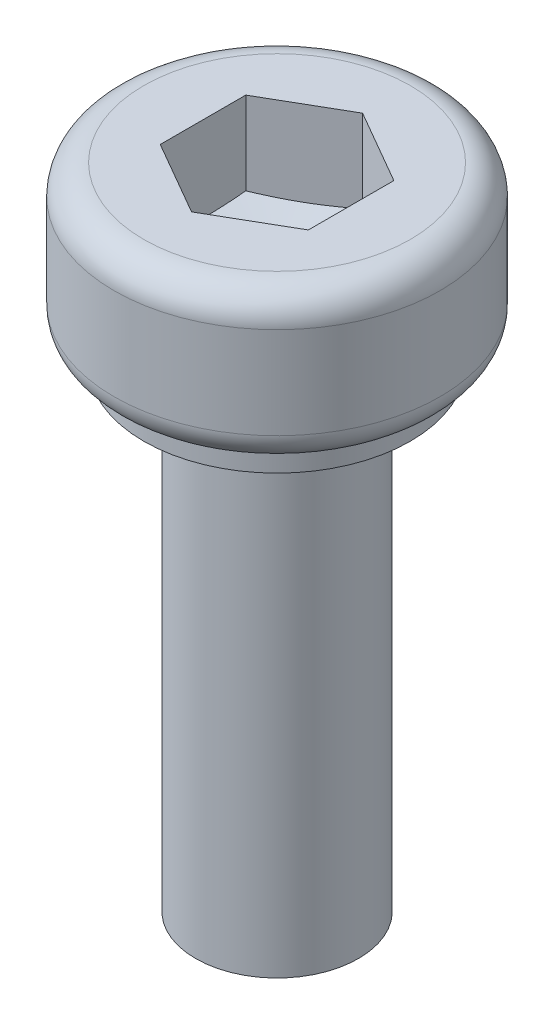
ISO-10303-21;
HEADER;
FILE_DESCRIPTION(('STEP AP214'),'2;1');
FILE_NAME('part.step','',(''),(''),'','','');
FILE_SCHEMA(('AUTOMOTIVE_DESIGN { 1 0 10303 214 1 1 1 1 }'));
ENDSEC;
DATA;
#1=APPLICATION_CONTEXT('core data for automotive mechanical design processes');
#2=APPLICATION_PROTOCOL_DEFINITION('international standard','automotive_design',2000,#1);
#3=PRODUCT_CONTEXT('',#1,'mechanical');
#4=PRODUCT('Part','Part','',(#3));
#5=PRODUCT_RELATED_PRODUCT_CATEGORY('part','',(#4));
#6=PRODUCT_DEFINITION_FORMATION('','',#4);
#7=PRODUCT_DEFINITION_CONTEXT('part definition',#1,'design');
#8=PRODUCT_DEFINITION('design','',#6,#7);
#9=PRODUCT_DEFINITION_SHAPE('','',#8);
#10=(LENGTH_UNIT() NAMED_UNIT(*) SI_UNIT(.MILLI.,.METRE.));
#11=(NAMED_UNIT(*) PLANE_ANGLE_UNIT() SI_UNIT($,.RADIAN.));
#12=(NAMED_UNIT(*) SI_UNIT($,.STERADIAN.) SOLID_ANGLE_UNIT());
#13=UNCERTAINTY_MEASURE_WITH_UNIT(LENGTH_MEASURE(1.E-05),#10,'distance_accuracy_value','');
#14=(GEOMETRIC_REPRESENTATION_CONTEXT(3) GLOBAL_UNCERTAINTY_ASSIGNED_CONTEXT((#13)) GLOBAL_UNIT_ASSIGNED_CONTEXT((#10,
#11,#12)) REPRESENTATION_CONTEXT('',''));
#15=CARTESIAN_POINT('',(0.,0.,0.));
#16=DIRECTION('',(0.,0.,1.));
#17=DIRECTION('',(1.,0.,0.));
#18=AXIS2_PLACEMENT_3D('',#15,#16,#17);
#19=CARTESIAN_POINT('',(0.,5.475,0.));
#20=DIRECTION('',(0.,-1.,0.));
#21=DIRECTION('',(0.,0.,-1.));
#22=AXIS2_PLACEMENT_3D('',#19,#20,#21);
#23=PLANE('',#22);
#24=DIRECTION('',(-0.866025403784439,0.,0.5));
#25=VECTOR('',#24,1.);
#26=CARTESIAN_POINT('',(0.,5.475,-1.44337567297406));
#27=LINE('',#26,#25);
#28=CARTESIAN_POINT('',(0.,5.475,-1.44337567297406));
#29=VERTEX_POINT('',#28);
#30=CARTESIAN_POINT('',(-1.25,5.475,-0.721687836487033));
#31=VERTEX_POINT('',#30);
#32=EDGE_CURVE('E214',#29,#31,#27,.T.);
#33=ORIENTED_EDGE('',*,*,#32,.F.);
#34=DIRECTION('',(-0.866025403784439,0.,-0.5));
#35=VECTOR('',#34,1.);
#36=CARTESIAN_POINT('',(1.25,5.475,-0.721687836487033));
#37=LINE('',#36,#35);
#38=CARTESIAN_POINT('',(1.25,5.475,-0.721687836487033));
#39=VERTEX_POINT('',#38);
#40=EDGE_CURVE('E63',#39,#29,#37,.T.);
#41=ORIENTED_EDGE('',*,*,#40,.F.);
#42=DIRECTION('',(0.,0.,-1.));
#43=VECTOR('',#42,1.);
#44=CARTESIAN_POINT('',(1.25,5.475,0.721687836487033));
#45=LINE('',#44,#43);
#46=CARTESIAN_POINT('',(1.25,5.475,0.721687836487033));
#47=VERTEX_POINT('',#46);
#48=EDGE_CURVE('E125',#47,#39,#45,.T.);
#49=ORIENTED_EDGE('',*,*,#48,.F.);
#50=DIRECTION('',(0.866025403784439,0.,-0.5));
#51=VECTOR('',#50,1.);
#52=CARTESIAN_POINT('',(0.,5.475,1.44337567297406));
#53=LINE('',#52,#51);
#54=CARTESIAN_POINT('',(0.,5.475,1.44337567297406));
#55=VERTEX_POINT('',#54);
#56=EDGE_CURVE('E132',#55,#47,#53,.T.);
#57=ORIENTED_EDGE('',*,*,#56,.F.);
#58=DIRECTION('',(0.866025403784439,0.,0.5));
#59=VECTOR('',#58,1.);
#60=CARTESIAN_POINT('',(-1.25,5.475,0.721687836487033));
#61=LINE('',#60,#59);
#62=CARTESIAN_POINT('',(-1.25,5.475,0.721687836487033));
#63=VERTEX_POINT('',#62);
#64=EDGE_CURVE('E391',#63,#55,#61,.T.);
#65=ORIENTED_EDGE('',*,*,#64,.F.);
#66=DIRECTION('',(0.,0.,1.));
#67=VECTOR('',#66,1.);
#68=CARTESIAN_POINT('',(-1.25,5.475,-0.721687836487033));
#69=LINE('',#68,#67);
#70=EDGE_CURVE('E405',#31,#63,#69,.T.);
#71=ORIENTED_EDGE('',*,*,#70,.F.);
#72=EDGE_LOOP('',(#33,#41,#49,#57,#65,#71));
#73=FACE_BOUND('',#72,.T.);
#74=CARTESIAN_POINT('',(0.,5.475,0.));
#75=DIRECTION('',(0.,1.,0.));
#76=DIRECTION('',(0.,0.,1.));
#77=AXIS2_PLACEMENT_3D('',#74,#75,#76);
#78=CIRCLE('',#77,2.25);
#79=CARTESIAN_POINT('',(0.,5.475,2.25));
#80=VERTEX_POINT('',#79);
#81=EDGE_CURVE('E11',#80,#80,#78,.T.);
#82=ORIENTED_EDGE('',*,*,#81,.T.);
#83=EDGE_LOOP('',(#82));
#84=FACE_BOUND('',#83,.T.);
#85=ADVANCED_FACE('F48',(#73,#84),#23,.F.);
#86=CARTESIAN_POINT('',(0.,4.975,0.));
#87=DIRECTION('',(0.,1.,0.));
#88=DIRECTION('',(0.,0.,1.));
#89=AXIS2_PLACEMENT_3D('',#86,#87,#88);
#90=TOROIDAL_SURFACE('',#89,2.25,0.5);
#91=ORIENTED_EDGE('',*,*,#81,.F.);
#92=EDGE_LOOP('',(#91));
#93=FACE_BOUND('',#92,.T.);
#94=CARTESIAN_POINT('',(0.,4.975,0.));
#95=DIRECTION('',(0.,1.,0.));
#96=DIRECTION('',(0.,0.,1.));
#97=AXIS2_PLACEMENT_3D('',#94,#95,#96);
#98=CIRCLE('',#97,2.75);
#99=CARTESIAN_POINT('',(0.,4.975,2.75));
#100=VERTEX_POINT('',#99);
#101=EDGE_CURVE('E56',#100,#100,#98,.T.);
#102=ORIENTED_EDGE('',*,*,#101,.T.);
#103=EDGE_LOOP('',(#102));
#104=FACE_BOUND('',#103,.T.);
#105=ADVANCED_FACE('F205',(#93,#104),#90,.T.);
#106=CARTESIAN_POINT('',(0.,4.09422492401216,0.));
#107=DIRECTION('',(0.,1.,0.));
#108=DIRECTION('',(0.,0.,1.));
#109=AXIS2_PLACEMENT_3D('',#106,#107,#108);
#110=CYLINDRICAL_SURFACE('',#109,2.75);
#111=ORIENTED_EDGE('',*,*,#101,.F.);
#112=EDGE_LOOP('',(#111));
#113=FACE_BOUND('',#112,.T.);
#114=CARTESIAN_POINT('',(0.,3.425,0.));
#115=DIRECTION('',(0.,1.,0.));
#116=DIRECTION('',(0.,0.,1.));
#117=AXIS2_PLACEMENT_3D('',#114,#115,#116);
#118=CIRCLE('',#117,2.75);
#119=CARTESIAN_POINT('',(0.,3.425,2.75));
#120=VERTEX_POINT('',#119);
#121=EDGE_CURVE('E221',#120,#120,#118,.T.);
#122=ORIENTED_EDGE('',*,*,#121,.T.);
#123=EDGE_LOOP('',(#122));
#124=FACE_BOUND('',#123,.T.);
#125=ADVANCED_FACE('F210',(#113,#124),#110,.T.);
#126=CARTESIAN_POINT('',(0.,3.425,0.));
#127=DIRECTION('',(0.,1.,0.));
#128=DIRECTION('',(0.,0.,1.));
#129=AXIS2_PLACEMENT_3D('',#126,#127,#128);
#130=TOROIDAL_SURFACE('',#129,2.25,0.5);
#131=ORIENTED_EDGE('',*,*,#121,.F.);
#132=EDGE_LOOP('',(#131));
#133=FACE_BOUND('',#132,.T.);
#134=CARTESIAN_POINT('',(0.,2.925,0.));
#135=DIRECTION('',(0.,1.,0.));
#136=DIRECTION('',(0.,0.,1.));
#137=AXIS2_PLACEMENT_3D('',#134,#135,#136);
#138=CIRCLE('',#137,2.25);
#139=CARTESIAN_POINT('',(0.,2.925,2.25));
#140=VERTEX_POINT('',#139);
#141=EDGE_CURVE('E224',#140,#140,#138,.T.);
#142=ORIENTED_EDGE('',*,*,#141,.T.);
#143=EDGE_LOOP('',(#142));
#144=FACE_BOUND('',#143,.T.);
#145=ADVANCED_FACE('F261',(#133,#144),#130,.T.);
#146=CARTESIAN_POINT('',(0.,4.09422492401216,0.));
#147=DIRECTION('',(0.,1.,0.));
#148=DIRECTION('',(0.,0.,1.));
#149=AXIS2_PLACEMENT_3D('',#146,#147,#148);
#150=CYLINDRICAL_SURFACE('',#149,2.25);
#151=ORIENTED_EDGE('',*,*,#141,.F.);
#152=EDGE_LOOP('',(#151));
#153=FACE_BOUND('',#152,.T.);
#154=CARTESIAN_POINT('',(0.,2.525,0.));
#155=DIRECTION('',(0.,1.,0.));
#156=DIRECTION('',(0.,0.,1.));
#157=AXIS2_PLACEMENT_3D('',#154,#155,#156);
#158=CIRCLE('',#157,2.25);
#159=CARTESIAN_POINT('',(0.,2.525,2.25));
#160=VERTEX_POINT('',#159);
#161=EDGE_CURVE('E230',#160,#160,#158,.T.);
#162=ORIENTED_EDGE('',*,*,#161,.T.);
#163=EDGE_LOOP('',(#162));
#164=FACE_BOUND('',#163,.T.);
#165=ADVANCED_FACE('F257',(#153,#164),#150,.T.);
#166=CARTESIAN_POINT('',(2.25,2.525,0.));
#167=DIRECTION('',(0.,1.,0.));
#168=DIRECTION('',(0.,0.,1.));
#169=AXIS2_PLACEMENT_3D('',#166,#167,#168);
#170=PLANE('',#169);
#171=ORIENTED_EDGE('',*,*,#161,.F.);
#172=EDGE_LOOP('',(#171));
#173=FACE_BOUND('',#172,.T.);
#174=CARTESIAN_POINT('',(0.,2.525,0.));
#175=DIRECTION('',(0.,1.,0.));
#176=DIRECTION('',(0.,0.,1.));
#177=AXIS2_PLACEMENT_3D('',#174,#175,#176);
#178=CIRCLE('',#177,1.375);
#179=CARTESIAN_POINT('',(0.,2.525,1.375));
#180=VERTEX_POINT('',#179);
#181=EDGE_CURVE('E233',#180,#180,#178,.T.);
#182=ORIENTED_EDGE('',*,*,#181,.T.);
#183=EDGE_LOOP('',(#182));
#184=FACE_BOUND('',#183,.T.);
#185=ADVANCED_FACE('F250',(#173,#184),#170,.F.);
#186=CARTESIAN_POINT('',(0.,4.09422492401216,0.));
#187=DIRECTION('',(0.,1.,0.));
#188=DIRECTION('',(0.,0.,1.));
#189=AXIS2_PLACEMENT_3D('',#186,#187,#188);
#190=CYLINDRICAL_SURFACE('',#189,1.375);
#191=ORIENTED_EDGE('',*,*,#181,.F.);
#192=EDGE_LOOP('',(#191));
#193=FACE_BOUND('',#192,.T.);
#194=CARTESIAN_POINT('',(0.,-5.475,0.));
#195=DIRECTION('',(0.,1.,0.));
#196=DIRECTION('',(0.,0.,1.));
#197=AXIS2_PLACEMENT_3D('',#194,#195,#196);
#198=CIRCLE('',#197,1.375);
#199=CARTESIAN_POINT('',(0.,-5.475,1.375));
#200=VERTEX_POINT('',#199);
#201=EDGE_CURVE('E111',#200,#200,#198,.T.);
#202=ORIENTED_EDGE('',*,*,#201,.T.);
#203=EDGE_LOOP('',(#202));
#204=FACE_BOUND('',#203,.T.);
#205=ADVANCED_FACE('F242',(#193,#204),#190,.T.);
#206=CARTESIAN_POINT('',(1.375,-5.475,0.));
#207=DIRECTION('',(0.,1.,0.));
#208=DIRECTION('',(0.,0.,1.));
#209=AXIS2_PLACEMENT_3D('',#206,#207,#208);
#210=PLANE('',#209);
#211=ORIENTED_EDGE('',*,*,#201,.F.);
#212=EDGE_LOOP('',(#211));
#213=FACE_BOUND('',#212,.T.);
#214=ADVANCED_FACE('F244',(#213),#210,.F.);
#215=CARTESIAN_POINT('',(1.25,3.475,-0.721687836487033));
#216=DIRECTION('',(0.5,0.,-0.866025403784439));
#217=DIRECTION('',(-0.866025403784439,0.,-0.5));
#218=AXIS2_PLACEMENT_3D('',#215,#216,#217);
#219=PLANE('',#218);
#220=CARTESIAN_POINT('',(-0.000199999999999668,4.07502213659224,-1.4434911430279));
#221=CARTESIAN_POINT('',(0.0518104295641313,4.06926246143579,-1.41346290751838));
#222=CARTESIAN_POINT('',(0.103869536937207,4.06403974723522,-1.38340656786277));
#223=CARTESIAN_POINT('',(0.208081999228772,4.05487120303171,-1.32323947470582));
#224=CARTESIAN_POINT('',(0.260235371100698,4.05092563186542,-1.29312871141642));
#225=CARTESIAN_POINT('',(0.364473709342653,4.0445253362828,-1.23294667877254));
#226=CARTESIAN_POINT('',(0.416558490077755,4.04206668415272,-1.20287551659445));
#227=CARTESIAN_POINT('',(0.520762183051685,4.03877043652459,-1.1427134864054));
#228=CARTESIAN_POINT('',(0.572881091525842,4.03793268513289,-1.11262262056797));
#229=CARTESIAN_POINT('',(0.677118908474158,4.03793268513289,-1.05244088889312));
#230=CARTESIAN_POINT('',(0.729237816948315,4.03877043652459,-1.0223500230557));
#231=CARTESIAN_POINT('',(0.833441509922245,4.04206668415272,-0.962187992866649));
#232=CARTESIAN_POINT('',(0.885526290657347,4.0445253362828,-0.932116830688555));
#233=CARTESIAN_POINT('',(0.989764628899302,4.05092563186542,-0.871934798044683));
#234=CARTESIAN_POINT('',(1.04191800077123,4.05487120303171,-0.84182403475528));
#235=CARTESIAN_POINT('',(1.14613046306279,4.06403974723522,-0.781656941598331));
#236=CARTESIAN_POINT('',(1.19818957043587,4.06926246143579,-0.751600601942714));
#237=CARTESIAN_POINT('',(1.2502,4.07502213659224,-0.721572366433195));
#238=B_SPLINE_CURVE_WITH_KNOTS('',3,(#220,#221,#222,#223,#224,#225,#226,#227,#228,#229,#230,
#231,#232,#233,#234,#235,#236,#237),.UNSPECIFIED.,.F.,.F.,(4,2,2,2,2,2,2,2,4),(0.,
0.181000745388271,0.362038150988405,0.542595231362164,0.723134945402974,0.903674659443784,
1.08423173981754,1.26526914541768,1.44626989080595),.UNSPECIFIED.);
#239=CARTESIAN_POINT('',(0.,4.075,-1.44337567297406));
#240=VERTEX_POINT('',#239);
#241=CARTESIAN_POINT('',(1.25,4.075,-0.721687836487033));
#242=VERTEX_POINT('',#241);
#243=EDGE_CURVE('E115',#240,#242,#238,.T.);
#244=ORIENTED_EDGE('',*,*,#243,.T.);
#245=DIRECTION('',(0.,1.,0.));
#246=VECTOR('',#245,1.);
#247=CARTESIAN_POINT('',(1.25,3.475,-0.721687836487033));
#248=LINE('',#247,#246);
#249=EDGE_CURVE('E112',#242,#39,#248,.T.);
#250=ORIENTED_EDGE('',*,*,#249,.T.);
#251=ORIENTED_EDGE('',*,*,#40,.T.);
#252=DIRECTION('',(0.,1.,0.));
#253=VECTOR('',#252,1.);
#254=CARTESIAN_POINT('',(0.,3.475,-1.44337567297406));
#255=LINE('',#254,#253);
#256=EDGE_CURVE('E106',#240,#29,#255,.T.);
#257=ORIENTED_EDGE('',*,*,#256,.F.);
#258=EDGE_LOOP('',(#244,#250,#251,#257));
#259=FACE_BOUND('',#258,.T.);
#260=ADVANCED_FACE('F123',(#259),#219,.F.);
#261=CARTESIAN_POINT('',(1.25,3.475,0.721687836487033));
#262=DIRECTION('',(1.,0.,0.));
#263=DIRECTION('',(0.,0.,-1.));
#264=AXIS2_PLACEMENT_3D('',#261,#262,#263);
#265=PLANE('',#264);
#266=CARTESIAN_POINT('',(1.25,4.27986393266067,-2.17905403611333));
#267=CARTESIAN_POINT('',(1.25,4.26241167422932,-2.07395009860659));
#268=CARTESIAN_POINT('',(1.25,4.24522032681984,-1.96879996781174));
#269=CARTESIAN_POINT('',(1.25,4.21170531820386,-1.75835059041696));
#270=CARTESIAN_POINT('',(1.25,4.1953817490476,-1.65305132920933));
#271=CARTESIAN_POINT('',(1.25,4.16387651632622,-1.44176294489903));
#272=CARTESIAN_POINT('',(1.25,4.14870071461258,-1.33577293769499));
#273=CARTESIAN_POINT('',(1.25,4.12016928542285,-1.12353979169023));
#274=CARTESIAN_POINT('',(1.25,4.10681373080936,-1.01729664292962));
#275=CARTESIAN_POINT('',(1.25,4.08296213919632,-0.806005172192662));
#276=CARTESIAN_POINT('',(1.25,4.0724282853726,-0.70096123668011));
#277=CARTESIAN_POINT('',(1.25,4.05508287381984,-0.490567790876244));
#278=CARTESIAN_POINT('',(1.25,4.04827077429862,-0.385218327307929));
#279=CARTESIAN_POINT('',(1.25,4.03946010519578,-0.174546490096711));
#280=CARTESIAN_POINT('',(1.25,4.03745059762555,-0.0692246022002262));
#281=CARTESIAN_POINT('',(1.25,4.03861439807437,0.141392413524245));
#282=CARTESIAN_POINT('',(1.25,4.04178784167731,0.246687540580112));
#283=CARTESIAN_POINT('',(1.25,4.0511996283626,0.428094047279161));
#284=CARTESIAN_POINT('',(1.25,4.05635479919092,0.504266022940998));
#285=CARTESIAN_POINT('',(1.25,4.06864181101614,0.656446776567246));
#286=CARTESIAN_POINT('',(1.25,4.0757736272437,0.732455556564634));
#287=CARTESIAN_POINT('',(1.25,4.09949527042362,0.960485133272153));
#288=CARTESIAN_POINT('',(1.25,4.11839567377015,1.11226253619117));
#289=CARTESIAN_POINT('',(1.25,4.14949527165966,1.34036100724887));
#290=CARTESIAN_POINT('',(1.25,4.16038509955885,1.41687238761891));
#291=CARTESIAN_POINT('',(1.25,4.18286077200284,1.56979468542722));
#292=CARTESIAN_POINT('',(1.25,4.19444662073168,1.64620560225877));
#293=CARTESIAN_POINT('',(1.25,4.21810928108022,1.7987279380359));
#294=CARTESIAN_POINT('',(1.25,4.23018460256629,1.87483959068598));
#295=CARTESIAN_POINT('',(1.25,4.25474485969705,2.02699389967147));
#296=CARTESIAN_POINT('',(1.25,4.26722977968569,2.10303655853011));
#297=CARTESIAN_POINT('',(1.25,4.27986393266067,2.17905403611333));
#298=B_SPLINE_CURVE_WITH_KNOTS('',3,(#266,#267,#268,#269,#270,#271,#272,#273,#274,#275,#276,
#277,#278,#279,#280,#281,#282,#283,#284,#285,#286,#287,#288,#289,#290,#291,#292,#293,#294,#295,
#296,#297),.UNSPECIFIED.,.F.,.F.,(4,2,2,2,2,2,2,2,2,2,2,2,2,2,2,4),(0.,0.319633094293302,
0.639300026536296,0.960502494708345,1.28171781650624,1.59838422210634,1.91500451689018,
2.23090301324148,2.54680977350041,2.77582029179633,3.00482794049193,3.46358394927292,
3.69543178901939,3.92728102262634,4.15847082499727,4.38965180089788),.UNSPECIFIED.);
#299=CARTESIAN_POINT('',(1.25,4.075,0.721687836487033));
#300=VERTEX_POINT('',#299);
#301=EDGE_CURVE('E119',#242,#300,#298,.T.);
#302=ORIENTED_EDGE('',*,*,#301,.T.);
#303=DIRECTION('',(0.,1.,0.));
#304=VECTOR('',#303,1.);
#305=CARTESIAN_POINT('',(1.25,3.475,0.721687836487033));
#306=LINE('',#305,#304);
#307=EDGE_CURVE('E389',#300,#47,#306,.T.);
#308=ORIENTED_EDGE('',*,*,#307,.T.);
#309=ORIENTED_EDGE('',*,*,#48,.T.);
#310=ORIENTED_EDGE('',*,*,#249,.F.);
#311=EDGE_LOOP('',(#302,#308,#309,#310));
#312=FACE_BOUND('',#311,.T.);
#313=ADVANCED_FACE('F187',(#312),#265,.F.);
#314=CARTESIAN_POINT('',(0.,3.475,1.44337567297406));
#315=DIRECTION('',(0.5,0.,0.866025403784439));
#316=DIRECTION('',(0.866025403784439,0.,-0.5));
#317=AXIS2_PLACEMENT_3D('',#314,#315,#316);
#318=PLANE('',#317);
#319=CARTESIAN_POINT('',(1.2502,4.07502213659224,0.721572366433195));
#320=CARTESIAN_POINT('',(1.19818957043587,4.06926246143579,0.751600601942714));
#321=CARTESIAN_POINT('',(1.14613046306279,4.06403974723522,0.781656941598331));
#322=CARTESIAN_POINT('',(1.04191800077123,4.05487120303171,0.84182403475528));
#323=CARTESIAN_POINT('',(0.989764628899303,4.05092563186542,0.871934798044683));
#324=CARTESIAN_POINT('',(0.885526290657347,4.0445253362828,0.932116830688555));
#325=CARTESIAN_POINT('',(0.833441509922245,4.04206668415272,0.962187992866649));
#326=CARTESIAN_POINT('',(0.729237816948315,4.03877043652459,1.0223500230557));
#327=CARTESIAN_POINT('',(0.677118908474157,4.03793268513289,1.05244088889312));
#328=CARTESIAN_POINT('',(0.572881091525842,4.03793268513289,1.11262262056797));
#329=CARTESIAN_POINT('',(0.520762183051684,4.03877043652459,1.1427134864054));
#330=CARTESIAN_POINT('',(0.416558490077755,4.04206668415272,1.20287551659445));
#331=CARTESIAN_POINT('',(0.364473709342653,4.0445253362828,1.23294667877254));
#332=CARTESIAN_POINT('',(0.260235371100697,4.05092563186542,1.29312871141642));
#333=CARTESIAN_POINT('',(0.208081999228772,4.05487120303171,1.32323947470582));
#334=CARTESIAN_POINT('',(0.103869536937207,4.06403974723522,1.38340656786277));
#335=CARTESIAN_POINT('',(0.0518104295641311,4.06926246143579,1.41346290751838));
#336=CARTESIAN_POINT('',(-0.000200000000000036,4.07502213659224,1.4434911430279));
#337=B_SPLINE_CURVE_WITH_KNOTS('',3,(#319,#320,#321,#322,#323,#324,#325,#326,#327,#328,#329,
#330,#331,#332,#333,#334,#335,#336),.UNSPECIFIED.,.F.,.F.,(4,2,2,2,2,2,2,2,4),(0.,
0.181000745388271,0.362038150988405,0.542595231362164,0.723134945402974,0.903674659443784,
1.08423173981754,1.26526914541768,1.44626989080595),.UNSPECIFIED.);
#338=CARTESIAN_POINT('',(0.,4.075,1.44337567297406));
#339=VERTEX_POINT('',#338);
#340=EDGE_CURVE('E170',#300,#339,#337,.T.);
#341=ORIENTED_EDGE('',*,*,#340,.T.);
#342=DIRECTION('',(0.,1.,0.));
#343=VECTOR('',#342,1.);
#344=CARTESIAN_POINT('',(0.,3.475,1.44337567297406));
#345=LINE('',#344,#343);
#346=EDGE_CURVE('E387',#339,#55,#345,.T.);
#347=ORIENTED_EDGE('',*,*,#346,.T.);
#348=ORIENTED_EDGE('',*,*,#56,.T.);
#349=ORIENTED_EDGE('',*,*,#307,.F.);
#350=EDGE_LOOP('',(#341,#347,#348,#349));
#351=FACE_BOUND('',#350,.T.);
#352=ADVANCED_FACE('F190',(#351),#318,.F.);
#353=CARTESIAN_POINT('',(-1.25,3.475,0.721687836487033));
#354=DIRECTION('',(-0.5,0.,0.866025403784439));
#355=DIRECTION('',(0.866025403784439,0.,0.5));
#356=AXIS2_PLACEMENT_3D('',#353,#354,#355);
#357=PLANE('',#356);
#358=CARTESIAN_POINT('',(0.000199999999999786,4.07502213659224,1.4434911430279));
#359=CARTESIAN_POINT('',(-0.0518104295641313,4.06926246143579,1.41346290751838));
#360=CARTESIAN_POINT('',(-0.103869536937207,4.06403974723522,1.38340656786277));
#361=CARTESIAN_POINT('',(-0.208081999228772,4.05487120303171,1.32323947470582));
#362=CARTESIAN_POINT('',(-0.260235371100697,4.05092563186542,1.29312871141641));
#363=CARTESIAN_POINT('',(-0.364473709342653,4.0445253362828,1.23294667877254));
#364=CARTESIAN_POINT('',(-0.416558490077755,4.04206668415272,1.20287551659445));
#365=CARTESIAN_POINT('',(-0.520762183051685,4.03877043652459,1.1427134864054));
#366=CARTESIAN_POINT('',(-0.572881091525842,4.03793268513289,1.11262262056797));
#367=CARTESIAN_POINT('',(-0.677118908474158,4.03793268513289,1.05244088889312));
#368=CARTESIAN_POINT('',(-0.729237816948315,4.03877043652459,1.0223500230557));
#369=CARTESIAN_POINT('',(-0.833441509922245,4.04206668415272,0.962187992866648));
#370=CARTESIAN_POINT('',(-0.885526290657347,4.0445253362828,0.932116830688555));
#371=CARTESIAN_POINT('',(-0.989764628899303,4.05092563186542,0.871934798044682));
#372=CARTESIAN_POINT('',(-1.04191800077123,4.05487120303171,0.84182403475528));
#373=CARTESIAN_POINT('',(-1.14613046306279,4.06403974723522,0.781656941598331));
#374=CARTESIAN_POINT('',(-1.19818957043587,4.06926246143579,0.751600601942714));
#375=CARTESIAN_POINT('',(-1.2502,4.07502213659224,0.721572366433195));
#376=B_SPLINE_CURVE_WITH_KNOTS('',3,(#358,#359,#360,#361,#362,#363,#364,#365,#366,#367,#368,
#369,#370,#371,#372,#373,#374,#375),.UNSPECIFIED.,.F.,.F.,(4,2,2,2,2,2,2,2,4),(0.,
0.181000745388271,0.362038150988405,0.542595231362164,0.723134945402974,0.903674659443784,
1.08423173981754,1.26526914541768,1.44626989080595),.UNSPECIFIED.);
#377=CARTESIAN_POINT('',(-1.25,4.075,0.721687836487033));
#378=VERTEX_POINT('',#377);
#379=EDGE_CURVE('E163',#339,#378,#376,.T.);
#380=ORIENTED_EDGE('',*,*,#379,.T.);
#381=DIRECTION('',(0.,1.,0.));
#382=VECTOR('',#381,1.);
#383=CARTESIAN_POINT('',(-1.25,3.475,0.721687836487033));
#384=LINE('',#383,#382);
#385=EDGE_CURVE('E129',#378,#63,#384,.T.);
#386=ORIENTED_EDGE('',*,*,#385,.T.);
#387=ORIENTED_EDGE('',*,*,#64,.T.);
#388=ORIENTED_EDGE('',*,*,#346,.F.);
#389=EDGE_LOOP('',(#380,#386,#387,#388));
#390=FACE_BOUND('',#389,.T.);
#391=ADVANCED_FACE('F194',(#390),#357,.F.);
#392=CARTESIAN_POINT('',(-1.25,3.475,-0.721687836487033));
#393=DIRECTION('',(-1.,0.,0.));
#394=DIRECTION('',(0.,0.,1.));
#395=AXIS2_PLACEMENT_3D('',#392,#393,#394);
#396=PLANE('',#395);
#397=CARTESIAN_POINT('',(-1.25,4.27986393266067,2.17905403611333));
#398=CARTESIAN_POINT('',(-1.25,4.26241167422932,2.07395009860659));
#399=CARTESIAN_POINT('',(-1.25,4.24522032681984,1.96879996781174));
#400=CARTESIAN_POINT('',(-1.25,4.21170531820386,1.75835059041696));
#401=CARTESIAN_POINT('',(-1.25,4.1953817490476,1.65305132920933));
#402=CARTESIAN_POINT('',(-1.25,4.16387651632622,1.44176294489903));
#403=CARTESIAN_POINT('',(-1.25,4.14870071461258,1.33577293769499));
#404=CARTESIAN_POINT('',(-1.25,4.12016928542285,1.12353979169023));
#405=CARTESIAN_POINT('',(-1.25,4.10681373080936,1.01729664292962));
#406=CARTESIAN_POINT('',(-1.25,4.08296213919632,0.806005172192662));
#407=CARTESIAN_POINT('',(-1.25,4.0724282853726,0.700961236680109));
#408=CARTESIAN_POINT('',(-1.25,4.05508287381984,0.490567790876243));
#409=CARTESIAN_POINT('',(-1.25,4.04827077429862,0.385218327307928));
#410=CARTESIAN_POINT('',(-1.25,4.03946010519578,0.17454649009671));
#411=CARTESIAN_POINT('',(-1.25,4.03745059762555,0.0692246022002257));
#412=CARTESIAN_POINT('',(-1.25,4.03861439807437,-0.141392413524246));
#413=CARTESIAN_POINT('',(-1.25,4.04178784167731,-0.246687540580112));
#414=CARTESIAN_POINT('',(-1.25,4.0511996283626,-0.428094047279161));
#415=CARTESIAN_POINT('',(-1.25,4.05635479919092,-0.504266022940999));
#416=CARTESIAN_POINT('',(-1.25,4.06864181101614,-0.656446776567247));
#417=CARTESIAN_POINT('',(-1.25,4.0757736272437,-0.732455556564635));
#418=CARTESIAN_POINT('',(-1.25,4.09949527042362,-0.960485133272153));
#419=CARTESIAN_POINT('',(-1.25,4.11839567377015,-1.11226253619117));
#420=CARTESIAN_POINT('',(-1.25,4.14949527165966,-1.34036100724887));
#421=CARTESIAN_POINT('',(-1.25,4.16038509955885,-1.41687238761891));
#422=CARTESIAN_POINT('',(-1.25,4.18286077200284,-1.56979468542722));
#423=CARTESIAN_POINT('',(-1.25,4.19444662073168,-1.64620560225877));
#424=CARTESIAN_POINT('',(-1.25,4.21810928108022,-1.7987279380359));
#425=CARTESIAN_POINT('',(-1.25,4.23018460256629,-1.87483959068598));
#426=CARTESIAN_POINT('',(-1.25,4.25474485969705,-2.02699389967147));
#427=CARTESIAN_POINT('',(-1.25,4.26722977968569,-2.10303655853011));
#428=CARTESIAN_POINT('',(-1.25,4.27986393266067,-2.17905403611333));
#429=B_SPLINE_CURVE_WITH_KNOTS('',3,(#397,#398,#399,#400,#401,#402,#403,#404,#405,#406,#407,
#408,#409,#410,#411,#412,#413,#414,#415,#416,#417,#418,#419,#420,#421,#422,#423,#424,#425,#426,
#427,#428),.UNSPECIFIED.,.F.,.F.,(4,2,2,2,2,2,2,2,2,2,2,2,2,2,2,4),(0.,0.319633094293302,
0.639300026536295,0.960502494708344,1.28171781650624,1.59838422210634,1.91500451689018,
2.23090301324148,2.54680977350041,2.77582029179633,3.00482794049193,3.46358394927292,
3.69543178901939,3.92728102262634,4.15847082499726,4.38965180089787),.UNSPECIFIED.);
#430=CARTESIAN_POINT('',(-1.25,4.075,-0.721687836487033));
#431=VERTEX_POINT('',#430);
#432=EDGE_CURVE('E71',#378,#431,#429,.T.);
#433=ORIENTED_EDGE('',*,*,#432,.T.);
#434=DIRECTION('',(0.,1.,0.));
#435=VECTOR('',#434,1.);
#436=CARTESIAN_POINT('',(-1.25,3.475,-0.721687836487033));
#437=LINE('',#436,#435);
#438=EDGE_CURVE('E108',#431,#31,#437,.T.);
#439=ORIENTED_EDGE('',*,*,#438,.T.);
#440=ORIENTED_EDGE('',*,*,#70,.T.);
#441=ORIENTED_EDGE('',*,*,#385,.F.);
#442=EDGE_LOOP('',(#433,#439,#440,#441));
#443=FACE_BOUND('',#442,.T.);
#444=ADVANCED_FACE('F198',(#443),#396,.F.);
#445=CARTESIAN_POINT('',(0.,3.475,-1.44337567297406));
#446=DIRECTION('',(-0.5,0.,-0.866025403784439));
#447=DIRECTION('',(-0.866025403784439,0.,0.5));
#448=AXIS2_PLACEMENT_3D('',#445,#446,#447);
#449=PLANE('',#448);
#450=CARTESIAN_POINT('',(-1.2502,4.07502213659224,-0.721572366433195));
#451=CARTESIAN_POINT('',(-1.19818957043587,4.06926246143579,-0.751600601942714));
#452=CARTESIAN_POINT('',(-1.14613046306279,4.06403974723522,-0.781656941598331));
#453=CARTESIAN_POINT('',(-1.04191800077123,4.05487120303171,-0.84182403475528));
#454=CARTESIAN_POINT('',(-0.989764628899302,4.05092563186542,-0.871934798044683));
#455=CARTESIAN_POINT('',(-0.885526290657347,4.0445253362828,-0.932116830688555));
#456=CARTESIAN_POINT('',(-0.833441509922245,4.04206668415272,-0.962187992866649));
#457=CARTESIAN_POINT('',(-0.729237816948315,4.03877043652459,-1.0223500230557));
#458=CARTESIAN_POINT('',(-0.677118908474157,4.03793268513289,-1.05244088889312));
#459=CARTESIAN_POINT('',(-0.572881091525842,4.03793268513289,-1.11262262056797));
#460=CARTESIAN_POINT('',(-0.520762183051684,4.03877043652459,-1.1427134864054));
#461=CARTESIAN_POINT('',(-0.416558490077755,4.04206668415272,-1.20287551659445));
#462=CARTESIAN_POINT('',(-0.364473709342652,4.0445253362828,-1.23294667877254));
#463=CARTESIAN_POINT('',(-0.260235371100697,4.05092563186542,-1.29312871141642));
#464=CARTESIAN_POINT('',(-0.208081999228772,4.05487120303171,-1.32323947470582));
#465=CARTESIAN_POINT('',(-0.103869536937207,4.06403974723522,-1.38340656786277));
#466=CARTESIAN_POINT('',(-0.0518104295641308,4.06926246143579,-1.41346290751838));
#467=CARTESIAN_POINT('',(0.00020000000000046,4.07502213659224,-1.4434911430279));
#468=B_SPLINE_CURVE_WITH_KNOTS('',3,(#450,#451,#452,#453,#454,#455,#456,#457,#458,#459,#460,
#461,#462,#463,#464,#465,#466,#467),.UNSPECIFIED.,.F.,.F.,(4,2,2,2,2,2,2,2,4),(0.,
0.181000745388271,0.362038150988405,0.542595231362164,0.723134945402975,0.903674659443785,
1.08423173981754,1.26526914541768,1.44626989080595),.UNSPECIFIED.);
#469=EDGE_CURVE('E102',#431,#240,#468,.T.);
#470=ORIENTED_EDGE('',*,*,#469,.T.);
#471=ORIENTED_EDGE('',*,*,#256,.T.);
#472=ORIENTED_EDGE('',*,*,#32,.T.);
#473=ORIENTED_EDGE('',*,*,#438,.F.);
#474=EDGE_LOOP('',(#470,#471,#472,#473));
#475=FACE_BOUND('',#474,.T.);
#476=ADVANCED_FACE('F104',(#475),#449,.F.);
#477=CARTESIAN_POINT('',(0.,3.875,0.));
#478=DIRECTION('',(0.,1.,0.));
#479=DIRECTION('',(0.,0.,1.));
#480=AXIS2_PLACEMENT_3D('',#477,#478,#479);
#481=PLANE('',#480);
#482=CARTESIAN_POINT('',(0.,3.875,0.));
#483=DIRECTION('',(0.,-1.,0.));
#484=DIRECTION('',(0.,0.,-1.));
#485=AXIS2_PLACEMENT_3D('',#482,#483,#484);
#486=CIRCLE('',#485,0.4);
#487=CARTESIAN_POINT('',(0.,3.875,-0.4));
#488=VERTEX_POINT('',#487);
#489=EDGE_CURVE('E378',#488,#488,#486,.T.);
#490=ORIENTED_EDGE('',*,*,#489,.F.);
#491=EDGE_LOOP('',(#490));
#492=FACE_BOUND('',#491,.T.);
#493=ADVANCED_FACE('F149',(#492),#481,.T.);
#494=CARTESIAN_POINT('',(0.,4.075,0.));
#495=DIRECTION('',(0.,1.,0.));
#496=DIRECTION('',(0.,0.,1.));
#497=AXIS2_PLACEMENT_3D('',#494,#495,#496);
#498=CONICAL_SURFACE('',#497,1.44337567297406,1.38140809939809);
#499=ORIENTED_EDGE('',*,*,#243,.F.);
#500=ORIENTED_EDGE('',*,*,#469,.F.);
#501=ORIENTED_EDGE('',*,*,#432,.F.);
#502=ORIENTED_EDGE('',*,*,#379,.F.);
#503=ORIENTED_EDGE('',*,*,#340,.F.);
#504=ORIENTED_EDGE('',*,*,#301,.F.);
#505=EDGE_LOOP('',(#499,#500,#501,#502,#503,#504));
#506=FACE_BOUND('',#505,.T.);
#507=ORIENTED_EDGE('',*,*,#489,.T.);
#508=EDGE_LOOP('',(#507));
#509=FACE_BOUND('',#508,.T.);
#510=ADVANCED_FACE('F116',(#506,#509),#498,.F.);
#511=CLOSED_SHELL('',(#85,#105,#125,#145,#165,#185,#205,#214,#260,#313,#352,#391,#444,#476,#493,#510));
#512=MANIFOLD_SOLID_BREP('B2',#511);
#513=ADVANCED_BREP_SHAPE_REPRESENTATION('',(#18,#512),#14);
#514=SHAPE_DEFINITION_REPRESENTATION(#9,#513);
ENDSEC;
END-ISO-10303-21;
